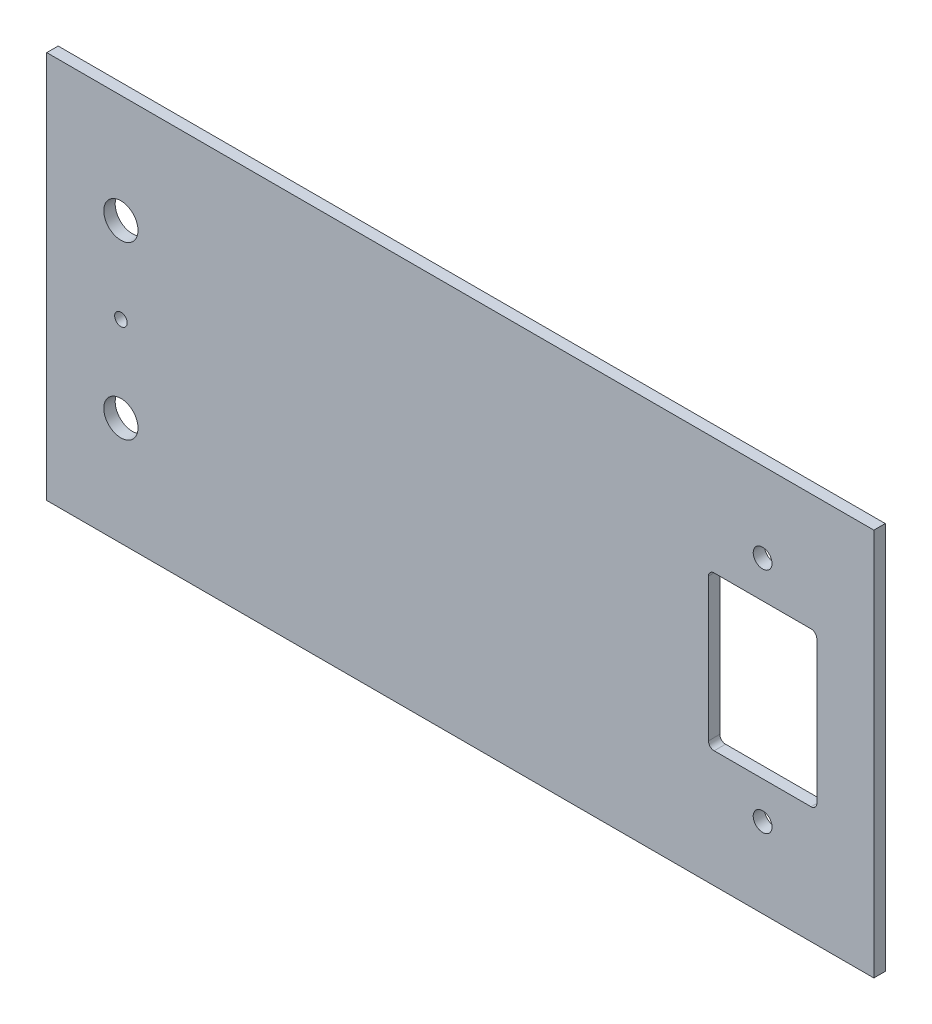
ISO-10303-21;
HEADER;
FILE_DESCRIPTION(('STEP AP214'),'2;1');
FILE_NAME('part.step','',(''),(''),'','','');
FILE_SCHEMA(('AUTOMOTIVE_DESIGN { 1 0 10303 214 1 1 1 1 }'));
ENDSEC;
DATA;
#1=APPLICATION_CONTEXT('core data for automotive mechanical design processes');
#2=APPLICATION_PROTOCOL_DEFINITION('international standard','automotive_design',2000,#1);
#3=PRODUCT_CONTEXT('',#1,'mechanical');
#4=PRODUCT('Part','Part','',(#3));
#5=PRODUCT_RELATED_PRODUCT_CATEGORY('part','',(#4));
#6=PRODUCT_DEFINITION_FORMATION('','',#4);
#7=PRODUCT_DEFINITION_CONTEXT('part definition',#1,'design');
#8=PRODUCT_DEFINITION('design','',#6,#7);
#9=PRODUCT_DEFINITION_SHAPE('','',#8);
#10=(LENGTH_UNIT() NAMED_UNIT(*) SI_UNIT(.MILLI.,.METRE.));
#11=(NAMED_UNIT(*) PLANE_ANGLE_UNIT() SI_UNIT($,.RADIAN.));
#12=(NAMED_UNIT(*) SI_UNIT($,.STERADIAN.) SOLID_ANGLE_UNIT());
#13=UNCERTAINTY_MEASURE_WITH_UNIT(LENGTH_MEASURE(1.E-05),#10,'distance_accuracy_value','');
#14=(GEOMETRIC_REPRESENTATION_CONTEXT(3) GLOBAL_UNCERTAINTY_ASSIGNED_CONTEXT((#13)) GLOBAL_UNIT_ASSIGNED_CONTEXT((#10,
#11,#12)) REPRESENTATION_CONTEXT('',''));
#15=CARTESIAN_POINT('',(0.,0.,0.));
#16=DIRECTION('',(0.,0.,1.));
#17=DIRECTION('',(1.,0.,0.));
#18=AXIS2_PLACEMENT_3D('',#15,#16,#17);
#19=CARTESIAN_POINT('',(-72.5,-34.,2.));
#20=DIRECTION('',(1.,0.,0.));
#21=DIRECTION('',(0.,0.,-1.));
#22=AXIS2_PLACEMENT_3D('',#19,#20,#21);
#23=PLANE('',#22);
#24=DIRECTION('',(0.,-1.,0.));
#25=VECTOR('',#24,1.);
#26=CARTESIAN_POINT('',(-72.5,-34.,0.));
#27=LINE('',#26,#25);
#28=CARTESIAN_POINT('',(-72.5,34.,0.));
#29=VERTEX_POINT('',#28);
#30=CARTESIAN_POINT('',(-72.5,-34.,0.));
#31=VERTEX_POINT('',#30);
#32=EDGE_CURVE('E207',#29,#31,#27,.T.);
#33=ORIENTED_EDGE('',*,*,#32,.T.);
#34=DIRECTION('',(0.,0.,-1.));
#35=VECTOR('',#34,1.);
#36=CARTESIAN_POINT('',(-72.5,-34.,2.));
#37=LINE('',#36,#35);
#38=CARTESIAN_POINT('',(-72.5,-34.,2.));
#39=VERTEX_POINT('',#38);
#40=EDGE_CURVE('E11',#39,#31,#37,.T.);
#41=ORIENTED_EDGE('',*,*,#40,.F.);
#42=DIRECTION('',(0.,-1.,0.));
#43=VECTOR('',#42,1.);
#44=CARTESIAN_POINT('',(-72.5,-34.,2.));
#45=LINE('',#44,#43);
#46=CARTESIAN_POINT('',(-72.5,34.,2.));
#47=VERTEX_POINT('',#46);
#48=EDGE_CURVE('E225',#47,#39,#45,.T.);
#49=ORIENTED_EDGE('',*,*,#48,.F.);
#50=DIRECTION('',(0.,0.,-1.));
#51=VECTOR('',#50,1.);
#52=CARTESIAN_POINT('',(-72.5,34.,2.));
#53=LINE('',#52,#51);
#54=EDGE_CURVE('E239',#47,#29,#53,.T.);
#55=ORIENTED_EDGE('',*,*,#54,.T.);
#56=EDGE_LOOP('',(#33,#41,#49,#55));
#57=FACE_BOUND('',#56,.T.);
#58=ADVANCED_FACE('F39',(#57),#23,.F.);
#59=CARTESIAN_POINT('',(72.5,-34.,2.));
#60=DIRECTION('',(0.,1.,0.));
#61=DIRECTION('',(-1.,0.,0.));
#62=AXIS2_PLACEMENT_3D('',#59,#60,#61);
#63=PLANE('',#62);
#64=DIRECTION('',(1.,0.,0.));
#65=VECTOR('',#64,1.);
#66=CARTESIAN_POINT('',(72.5,-34.,0.));
#67=LINE('',#66,#65);
#68=CARTESIAN_POINT('',(72.5,-34.,0.));
#69=VERTEX_POINT('',#68);
#70=EDGE_CURVE('E243',#31,#69,#67,.T.);
#71=ORIENTED_EDGE('',*,*,#70,.T.);
#72=DIRECTION('',(0.,0.,-1.));
#73=VECTOR('',#72,1.);
#74=CARTESIAN_POINT('',(72.5,-34.,2.));
#75=LINE('',#74,#73);
#76=CARTESIAN_POINT('',(72.5,-34.,2.));
#77=VERTEX_POINT('',#76);
#78=EDGE_CURVE('E47',#77,#69,#75,.T.);
#79=ORIENTED_EDGE('',*,*,#78,.F.);
#80=DIRECTION('',(1.,0.,0.));
#81=VECTOR('',#80,1.);
#82=CARTESIAN_POINT('',(72.5,-34.,2.));
#83=LINE('',#82,#81);
#84=EDGE_CURVE('E229',#39,#77,#83,.T.);
#85=ORIENTED_EDGE('',*,*,#84,.F.);
#86=ORIENTED_EDGE('',*,*,#40,.T.);
#87=EDGE_LOOP('',(#71,#79,#85,#86));
#88=FACE_BOUND('',#87,.T.);
#89=ADVANCED_FACE('F277',(#88),#63,.F.);
#90=CARTESIAN_POINT('',(72.5,-34.,2.));
#91=DIRECTION('',(-1.,0.,0.));
#92=DIRECTION('',(0.,0.,1.));
#93=AXIS2_PLACEMENT_3D('',#90,#91,#92);
#94=PLANE('',#93);
#95=DIRECTION('',(0.,1.,0.));
#96=VECTOR('',#95,1.);
#97=CARTESIAN_POINT('',(72.5,-34.,0.));
#98=LINE('',#97,#96);
#99=CARTESIAN_POINT('',(72.5,34.,0.));
#100=VERTEX_POINT('',#99);
#101=EDGE_CURVE('E246',#69,#100,#98,.T.);
#102=ORIENTED_EDGE('',*,*,#101,.T.);
#103=DIRECTION('',(0.,0.,-1.));
#104=VECTOR('',#103,1.);
#105=CARTESIAN_POINT('',(72.5,34.,2.));
#106=LINE('',#105,#104);
#107=CARTESIAN_POINT('',(72.5,34.,2.));
#108=VERTEX_POINT('',#107);
#109=EDGE_CURVE('E254',#108,#100,#106,.T.);
#110=ORIENTED_EDGE('',*,*,#109,.F.);
#111=DIRECTION('',(0.,1.,0.));
#112=VECTOR('',#111,1.);
#113=CARTESIAN_POINT('',(72.5,-34.,2.));
#114=LINE('',#113,#112);
#115=EDGE_CURVE('E233',#77,#108,#114,.T.);
#116=ORIENTED_EDGE('',*,*,#115,.F.);
#117=ORIENTED_EDGE('',*,*,#78,.T.);
#118=EDGE_LOOP('',(#102,#110,#116,#117));
#119=FACE_BOUND('',#118,.T.);
#120=ADVANCED_FACE('F263',(#119),#94,.F.);
#121=CARTESIAN_POINT('',(72.5,34.,2.));
#122=DIRECTION('',(0.,-1.,0.));
#123=DIRECTION('',(1.,0.,0.));
#124=AXIS2_PLACEMENT_3D('',#121,#122,#123);
#125=PLANE('',#124);
#126=DIRECTION('',(-1.,0.,0.));
#127=VECTOR('',#126,1.);
#128=CARTESIAN_POINT('',(72.5,34.,0.));
#129=LINE('',#128,#127);
#130=EDGE_CURVE('E230',#100,#29,#129,.T.);
#131=ORIENTED_EDGE('',*,*,#130,.T.);
#132=ORIENTED_EDGE('',*,*,#54,.F.);
#133=DIRECTION('',(-1.,0.,0.));
#134=VECTOR('',#133,1.);
#135=CARTESIAN_POINT('',(72.5,34.,2.));
#136=LINE('',#135,#134);
#137=EDGE_CURVE('E236',#108,#47,#136,.T.);
#138=ORIENTED_EDGE('',*,*,#137,.F.);
#139=ORIENTED_EDGE('',*,*,#109,.T.);
#140=EDGE_LOOP('',(#131,#132,#138,#139));
#141=FACE_BOUND('',#140,.T.);
#142=ADVANCED_FACE('F270',(#141),#125,.F.);
#143=CARTESIAN_POINT('',(0.,0.,2.));
#144=DIRECTION('',(0.,0.,1.));
#145=DIRECTION('',(1.,0.,0.));
#146=AXIS2_PLACEMENT_3D('',#143,#144,#145);
#147=PLANE('',#146);
#148=CARTESIAN_POINT('',(52.9999999999999,20.,2.));
#149=DIRECTION('',(0.,0.,1.));
#150=DIRECTION('',(1.,0.,0.));
#151=AXIS2_PLACEMENT_3D('',#148,#149,#150);
#152=CIRCLE('',#151,1.65);
#153=CARTESIAN_POINT('',(54.6499999999999,20.,2.));
#154=VERTEX_POINT('',#153);
#155=EDGE_CURVE('E357',#154,#154,#152,.T.);
#156=ORIENTED_EDGE('',*,*,#155,.F.);
#157=EDGE_LOOP('',(#156));
#158=FACE_BOUND('',#157,.T.);
#159=CARTESIAN_POINT('',(52.9999999999999,-20.,2.));
#160=DIRECTION('',(0.,0.,1.));
#161=DIRECTION('',(1.,0.,0.));
#162=AXIS2_PLACEMENT_3D('',#159,#160,#161);
#163=CIRCLE('',#162,1.65);
#164=CARTESIAN_POINT('',(54.6499999999999,-20.,2.));
#165=VERTEX_POINT('',#164);
#166=EDGE_CURVE('E365',#165,#165,#163,.T.);
#167=ORIENTED_EDGE('',*,*,#166,.F.);
#168=EDGE_LOOP('',(#167));
#169=FACE_BOUND('',#168,.T.);
#170=CARTESIAN_POINT('',(-59.5,15.,2.));
#171=DIRECTION('',(0.,0.,1.));
#172=DIRECTION('',(1.,0.,0.));
#173=AXIS2_PLACEMENT_3D('',#170,#171,#172);
#174=CIRCLE('',#173,3.);
#175=CARTESIAN_POINT('',(-56.5,15.,2.));
#176=VERTEX_POINT('',#175);
#177=EDGE_CURVE('E373',#176,#176,#174,.T.);
#178=ORIENTED_EDGE('',*,*,#177,.F.);
#179=EDGE_LOOP('',(#178));
#180=FACE_BOUND('',#179,.T.);
#181=CARTESIAN_POINT('',(-59.5,-15.,2.));
#182=DIRECTION('',(0.,0.,1.));
#183=DIRECTION('',(1.,0.,0.));
#184=AXIS2_PLACEMENT_3D('',#181,#182,#183);
#185=CIRCLE('',#184,3.);
#186=CARTESIAN_POINT('',(-56.5,-15.,2.));
#187=VERTEX_POINT('',#186);
#188=EDGE_CURVE('E157',#187,#187,#185,.T.);
#189=ORIENTED_EDGE('',*,*,#188,.F.);
#190=EDGE_LOOP('',(#189));
#191=FACE_BOUND('',#190,.T.);
#192=CARTESIAN_POINT('',(-59.5,0.,2.));
#193=DIRECTION('',(0.,0.,1.));
#194=DIRECTION('',(1.,0.,0.));
#195=AXIS2_PLACEMENT_3D('',#192,#193,#194);
#196=CIRCLE('',#195,1.1);
#197=CARTESIAN_POINT('',(-58.4,0.,2.));
#198=VERTEX_POINT('',#197);
#199=EDGE_CURVE('E347',#198,#198,#196,.T.);
#200=ORIENTED_EDGE('',*,*,#199,.F.);
#201=EDGE_LOOP('',(#200));
#202=FACE_BOUND('',#201,.T.);
#203=CARTESIAN_POINT('',(44.4999999999999,-12.5,2.));
#204=DIRECTION('',(0.,0.,1.));
#205=DIRECTION('',(-1.,0.,0.));
#206=AXIS2_PLACEMENT_3D('',#203,#204,#205);
#207=CIRCLE('',#206,1.);
#208=CARTESIAN_POINT('',(43.4999999999999,-12.5,2.));
#209=VERTEX_POINT('',#208);
#210=CARTESIAN_POINT('',(44.5,-13.5,2.));
#211=VERTEX_POINT('',#210);
#212=EDGE_CURVE('E54',#209,#211,#207,.T.);
#213=ORIENTED_EDGE('',*,*,#212,.F.);
#214=DIRECTION('',(0.,-1.,0.));
#215=VECTOR('',#214,1.);
#216=CARTESIAN_POINT('',(43.4999999999999,-12.5,2.));
#217=LINE('',#216,#215);
#218=CARTESIAN_POINT('',(43.4999999999999,12.5,2.));
#219=VERTEX_POINT('',#218);
#220=EDGE_CURVE('E150',#219,#209,#217,.T.);
#221=ORIENTED_EDGE('',*,*,#220,.F.);
#222=CARTESIAN_POINT('',(44.4999999999999,12.5,2.));
#223=DIRECTION('',(0.,0.,1.));
#224=DIRECTION('',(1.,0.,0.));
#225=AXIS2_PLACEMENT_3D('',#222,#223,#224);
#226=CIRCLE('',#225,1.);
#227=CARTESIAN_POINT('',(44.5,13.5,2.));
#228=VERTEX_POINT('',#227);
#229=EDGE_CURVE('E154',#228,#219,#226,.T.);
#230=ORIENTED_EDGE('',*,*,#229,.F.);
#231=DIRECTION('',(-1.,0.,0.));
#232=VECTOR('',#231,1.);
#233=CARTESIAN_POINT('',(61.4999999999999,13.5,2.));
#234=LINE('',#233,#232);
#235=CARTESIAN_POINT('',(61.4999999999999,13.5,2.));
#236=VERTEX_POINT('',#235);
#237=EDGE_CURVE('E197',#236,#228,#234,.T.);
#238=ORIENTED_EDGE('',*,*,#237,.F.);
#239=CARTESIAN_POINT('',(61.4999999999999,12.5,2.));
#240=DIRECTION('',(0.,0.,1.));
#241=DIRECTION('',(1.,0.,0.));
#242=AXIS2_PLACEMENT_3D('',#239,#240,#241);
#243=CIRCLE('',#242,1.);
#244=CARTESIAN_POINT('',(62.4999999999999,12.5,2.));
#245=VERTEX_POINT('',#244);
#246=EDGE_CURVE('E193',#245,#236,#243,.T.);
#247=ORIENTED_EDGE('',*,*,#246,.F.);
#248=DIRECTION('',(0.,1.,0.));
#249=VECTOR('',#248,1.);
#250=CARTESIAN_POINT('',(62.4999999999999,-12.5,2.));
#251=LINE('',#250,#249);
#252=CARTESIAN_POINT('',(62.4999999999999,-12.5,2.));
#253=VERTEX_POINT('',#252);
#254=EDGE_CURVE('E189',#253,#245,#251,.T.);
#255=ORIENTED_EDGE('',*,*,#254,.F.);
#256=CARTESIAN_POINT('',(61.4999999999999,-12.5,2.));
#257=DIRECTION('',(0.,0.,1.));
#258=DIRECTION('',(1.,0.,0.));
#259=AXIS2_PLACEMENT_3D('',#256,#257,#258);
#260=CIRCLE('',#259,1.);
#261=CARTESIAN_POINT('',(61.4999999999999,-13.5,2.));
#262=VERTEX_POINT('',#261);
#263=EDGE_CURVE('E185',#262,#253,#260,.T.);
#264=ORIENTED_EDGE('',*,*,#263,.F.);
#265=DIRECTION('',(1.,0.,0.));
#266=VECTOR('',#265,1.);
#267=CARTESIAN_POINT('',(61.4999999999999,-13.5,2.));
#268=LINE('',#267,#266);
#269=EDGE_CURVE('E181',#211,#262,#268,.T.);
#270=ORIENTED_EDGE('',*,*,#269,.F.);
#271=EDGE_LOOP('',(#213,#221,#230,#238,#247,#255,#264,#270));
#272=FACE_BOUND('',#271,.T.);
#273=ORIENTED_EDGE('',*,*,#48,.T.);
#274=ORIENTED_EDGE('',*,*,#84,.T.);
#275=ORIENTED_EDGE('',*,*,#115,.T.);
#276=ORIENTED_EDGE('',*,*,#137,.T.);
#277=EDGE_LOOP('',(#273,#274,#275,#276));
#278=FACE_BOUND('',#277,.T.);
#279=ADVANCED_FACE('F276',(#158,#169,#180,#191,#202,#272,#278),#147,.T.);
#280=CARTESIAN_POINT('',(0.,0.,0.));
#281=DIRECTION('',(0.,0.,1.));
#282=DIRECTION('',(1.,0.,0.));
#283=AXIS2_PLACEMENT_3D('',#280,#281,#282);
#284=PLANE('',#283);
#285=CARTESIAN_POINT('',(52.9999999999999,20.,0.));
#286=DIRECTION('',(0.,0.,1.));
#287=DIRECTION('',(1.,0.,0.));
#288=AXIS2_PLACEMENT_3D('',#285,#286,#287);
#289=CIRCLE('',#288,1.65);
#290=CARTESIAN_POINT('',(54.6499999999999,20.,0.));
#291=VERTEX_POINT('',#290);
#292=EDGE_CURVE('E182',#291,#291,#289,.T.);
#293=ORIENTED_EDGE('',*,*,#292,.T.);
#294=EDGE_LOOP('',(#293));
#295=FACE_BOUND('',#294,.T.);
#296=CARTESIAN_POINT('',(52.9999999999999,-20.,0.));
#297=DIRECTION('',(0.,0.,1.));
#298=DIRECTION('',(1.,0.,0.));
#299=AXIS2_PLACEMENT_3D('',#296,#297,#298);
#300=CIRCLE('',#299,1.65);
#301=CARTESIAN_POINT('',(54.6499999999999,-20.,0.));
#302=VERTEX_POINT('',#301);
#303=EDGE_CURVE('E361',#302,#302,#300,.T.);
#304=ORIENTED_EDGE('',*,*,#303,.T.);
#305=EDGE_LOOP('',(#304));
#306=FACE_BOUND('',#305,.T.);
#307=CARTESIAN_POINT('',(-59.5,15.,0.));
#308=DIRECTION('',(0.,0.,1.));
#309=DIRECTION('',(1.,0.,0.));
#310=AXIS2_PLACEMENT_3D('',#307,#308,#309);
#311=CIRCLE('',#310,3.);
#312=CARTESIAN_POINT('',(-56.5,15.,0.));
#313=VERTEX_POINT('',#312);
#314=EDGE_CURVE('E369',#313,#313,#311,.T.);
#315=ORIENTED_EDGE('',*,*,#314,.T.);
#316=EDGE_LOOP('',(#315));
#317=FACE_BOUND('',#316,.T.);
#318=CARTESIAN_POINT('',(-59.5,-15.,0.));
#319=DIRECTION('',(0.,0.,1.));
#320=DIRECTION('',(1.,0.,0.));
#321=AXIS2_PLACEMENT_3D('',#318,#319,#320);
#322=CIRCLE('',#321,3.);
#323=CARTESIAN_POINT('',(-56.5,-15.,0.));
#324=VERTEX_POINT('',#323);
#325=EDGE_CURVE('E376',#324,#324,#322,.T.);
#326=ORIENTED_EDGE('',*,*,#325,.T.);
#327=EDGE_LOOP('',(#326));
#328=FACE_BOUND('',#327,.T.);
#329=CARTESIAN_POINT('',(-59.5,0.,0.));
#330=DIRECTION('',(0.,0.,1.));
#331=DIRECTION('',(1.,0.,0.));
#332=AXIS2_PLACEMENT_3D('',#329,#330,#331);
#333=CIRCLE('',#332,1.1);
#334=CARTESIAN_POINT('',(-58.4,0.,0.));
#335=VERTEX_POINT('',#334);
#336=EDGE_CURVE('E344',#335,#335,#333,.T.);
#337=ORIENTED_EDGE('',*,*,#336,.T.);
#338=EDGE_LOOP('',(#337));
#339=FACE_BOUND('',#338,.T.);
#340=DIRECTION('',(0.,-1.,0.));
#341=VECTOR('',#340,1.);
#342=CARTESIAN_POINT('',(43.4999999999999,-12.5,0.));
#343=LINE('',#342,#341);
#344=CARTESIAN_POINT('',(43.4999999999999,12.5,0.));
#345=VERTEX_POINT('',#344);
#346=CARTESIAN_POINT('',(43.4999999999999,-12.5,0.));
#347=VERTEX_POINT('',#346);
#348=EDGE_CURVE('E137',#345,#347,#343,.T.);
#349=ORIENTED_EDGE('',*,*,#348,.T.);
#350=CARTESIAN_POINT('',(44.4999999999999,-12.5,0.));
#351=DIRECTION('',(0.,0.,1.));
#352=DIRECTION('',(-1.,0.,0.));
#353=AXIS2_PLACEMENT_3D('',#350,#351,#352);
#354=CIRCLE('',#353,1.);
#355=CARTESIAN_POINT('',(44.5,-13.5,0.));
#356=VERTEX_POINT('',#355);
#357=EDGE_CURVE('E130',#347,#356,#354,.T.);
#358=ORIENTED_EDGE('',*,*,#357,.T.);
#359=DIRECTION('',(1.,0.,0.));
#360=VECTOR('',#359,1.);
#361=CARTESIAN_POINT('',(61.4999999999999,-13.5,0.));
#362=LINE('',#361,#360);
#363=CARTESIAN_POINT('',(61.4999999999999,-13.5,0.));
#364=VERTEX_POINT('',#363);
#365=EDGE_CURVE('E140',#356,#364,#362,.T.);
#366=ORIENTED_EDGE('',*,*,#365,.T.);
#367=CARTESIAN_POINT('',(61.4999999999999,-12.5,0.));
#368=DIRECTION('',(0.,0.,1.));
#369=DIRECTION('',(1.,0.,0.));
#370=AXIS2_PLACEMENT_3D('',#367,#368,#369);
#371=CIRCLE('',#370,1.);
#372=CARTESIAN_POINT('',(62.4999999999999,-12.5,0.));
#373=VERTEX_POINT('',#372);
#374=EDGE_CURVE('E62',#364,#373,#371,.T.);
#375=ORIENTED_EDGE('',*,*,#374,.T.);
#376=DIRECTION('',(0.,1.,0.));
#377=VECTOR('',#376,1.);
#378=CARTESIAN_POINT('',(62.4999999999999,-12.5,0.));
#379=LINE('',#378,#377);
#380=CARTESIAN_POINT('',(62.4999999999999,12.5,0.));
#381=VERTEX_POINT('',#380);
#382=EDGE_CURVE('E162',#373,#381,#379,.T.);
#383=ORIENTED_EDGE('',*,*,#382,.T.);
#384=CARTESIAN_POINT('',(61.4999999999999,12.5,0.));
#385=DIRECTION('',(0.,0.,1.));
#386=DIRECTION('',(1.,0.,0.));
#387=AXIS2_PLACEMENT_3D('',#384,#385,#386);
#388=CIRCLE('',#387,1.);
#389=CARTESIAN_POINT('',(61.4999999999999,13.5,0.));
#390=VERTEX_POINT('',#389);
#391=EDGE_CURVE('E166',#381,#390,#388,.T.);
#392=ORIENTED_EDGE('',*,*,#391,.T.);
#393=DIRECTION('',(-1.,0.,0.));
#394=VECTOR('',#393,1.);
#395=CARTESIAN_POINT('',(61.4999999999999,13.5,0.));
#396=LINE('',#395,#394);
#397=CARTESIAN_POINT('',(44.5,13.5,0.));
#398=VERTEX_POINT('',#397);
#399=EDGE_CURVE('E170',#390,#398,#396,.T.);
#400=ORIENTED_EDGE('',*,*,#399,.T.);
#401=CARTESIAN_POINT('',(44.4999999999999,12.5,0.));
#402=DIRECTION('',(0.,0.,1.));
#403=DIRECTION('',(1.,0.,0.));
#404=AXIS2_PLACEMENT_3D('',#401,#402,#403);
#405=CIRCLE('',#404,1.);
#406=EDGE_CURVE('E174',#398,#345,#405,.T.);
#407=ORIENTED_EDGE('',*,*,#406,.T.);
#408=EDGE_LOOP('',(#349,#358,#366,#375,#383,#392,#400,#407));
#409=FACE_BOUND('',#408,.T.);
#410=ORIENTED_EDGE('',*,*,#32,.F.);
#411=ORIENTED_EDGE('',*,*,#130,.F.);
#412=ORIENTED_EDGE('',*,*,#101,.F.);
#413=ORIENTED_EDGE('',*,*,#70,.F.);
#414=EDGE_LOOP('',(#410,#411,#412,#413));
#415=FACE_BOUND('',#414,.T.);
#416=ADVANCED_FACE('F145',(#295,#306,#317,#328,#339,#409,#415),#284,.F.);
#417=CARTESIAN_POINT('',(44.4999999999999,-12.5,0.));
#418=DIRECTION('',(0.,0.,1.));
#419=DIRECTION('',(1.,0.,0.));
#420=AXIS2_PLACEMENT_3D('',#417,#418,#419);
#421=CYLINDRICAL_SURFACE('',#420,1.);
#422=ORIENTED_EDGE('',*,*,#212,.T.);
#423=DIRECTION('',(0.,0.,1.));
#424=VECTOR('',#423,1.);
#425=CARTESIAN_POINT('',(44.5,-13.5,0.));
#426=LINE('',#425,#424);
#427=EDGE_CURVE('E126',#356,#211,#426,.T.);
#428=ORIENTED_EDGE('',*,*,#427,.F.);
#429=ORIENTED_EDGE('',*,*,#357,.F.);
#430=DIRECTION('',(0.,0.,1.));
#431=VECTOR('',#430,1.);
#432=CARTESIAN_POINT('',(43.4999999999999,-12.5,0.));
#433=LINE('',#432,#431);
#434=EDGE_CURVE('E204',#347,#209,#433,.T.);
#435=ORIENTED_EDGE('',*,*,#434,.T.);
#436=EDGE_LOOP('',(#422,#428,#429,#435));
#437=FACE_BOUND('',#436,.T.);
#438=ADVANCED_FACE('F128',(#437),#421,.F.);
#439=CARTESIAN_POINT('',(43.4999999999999,-12.5,0.));
#440=DIRECTION('',(-1.,0.,0.));
#441=DIRECTION('',(0.,0.,1.));
#442=AXIS2_PLACEMENT_3D('',#439,#440,#441);
#443=PLANE('',#442);
#444=ORIENTED_EDGE('',*,*,#220,.T.);
#445=ORIENTED_EDGE('',*,*,#434,.F.);
#446=ORIENTED_EDGE('',*,*,#348,.F.);
#447=DIRECTION('',(0.,0.,1.));
#448=VECTOR('',#447,1.);
#449=CARTESIAN_POINT('',(43.4999999999999,12.5,0.));
#450=LINE('',#449,#448);
#451=EDGE_CURVE('E208',#345,#219,#450,.T.);
#452=ORIENTED_EDGE('',*,*,#451,.T.);
#453=EDGE_LOOP('',(#444,#445,#446,#452));
#454=FACE_BOUND('',#453,.T.);
#455=ADVANCED_FACE('F295',(#454),#443,.F.);
#456=CARTESIAN_POINT('',(44.4999999999999,12.5,0.));
#457=DIRECTION('',(0.,0.,1.));
#458=DIRECTION('',(1.,0.,0.));
#459=AXIS2_PLACEMENT_3D('',#456,#457,#458);
#460=CYLINDRICAL_SURFACE('',#459,1.);
#461=ORIENTED_EDGE('',*,*,#229,.T.);
#462=ORIENTED_EDGE('',*,*,#451,.F.);
#463=ORIENTED_EDGE('',*,*,#406,.F.);
#464=DIRECTION('',(0.,0.,1.));
#465=VECTOR('',#464,1.);
#466=CARTESIAN_POINT('',(44.5,13.5,0.));
#467=LINE('',#466,#465);
#468=EDGE_CURVE('E211',#398,#228,#467,.T.);
#469=ORIENTED_EDGE('',*,*,#468,.T.);
#470=EDGE_LOOP('',(#461,#462,#463,#469));
#471=FACE_BOUND('',#470,.T.);
#472=ADVANCED_FACE('F313',(#471),#460,.F.);
#473=CARTESIAN_POINT('',(61.4999999999999,13.5,0.));
#474=DIRECTION('',(0.,1.,0.));
#475=DIRECTION('',(-1.,0.,0.));
#476=AXIS2_PLACEMENT_3D('',#473,#474,#475);
#477=PLANE('',#476);
#478=ORIENTED_EDGE('',*,*,#237,.T.);
#479=ORIENTED_EDGE('',*,*,#468,.F.);
#480=ORIENTED_EDGE('',*,*,#399,.F.);
#481=DIRECTION('',(0.,0.,1.));
#482=VECTOR('',#481,1.);
#483=CARTESIAN_POINT('',(61.4999999999999,13.5,0.));
#484=LINE('',#483,#482);
#485=EDGE_CURVE('E214',#390,#236,#484,.T.);
#486=ORIENTED_EDGE('',*,*,#485,.T.);
#487=EDGE_LOOP('',(#478,#479,#480,#486));
#488=FACE_BOUND('',#487,.T.);
#489=ADVANCED_FACE('F309',(#488),#477,.F.);
#490=CARTESIAN_POINT('',(61.4999999999999,12.5,0.));
#491=DIRECTION('',(0.,0.,1.));
#492=DIRECTION('',(1.,0.,0.));
#493=AXIS2_PLACEMENT_3D('',#490,#491,#492);
#494=CYLINDRICAL_SURFACE('',#493,1.);
#495=ORIENTED_EDGE('',*,*,#246,.T.);
#496=ORIENTED_EDGE('',*,*,#485,.F.);
#497=ORIENTED_EDGE('',*,*,#391,.F.);
#498=DIRECTION('',(0.,0.,1.));
#499=VECTOR('',#498,1.);
#500=CARTESIAN_POINT('',(62.4999999999999,12.5,0.));
#501=LINE('',#500,#499);
#502=EDGE_CURVE('E217',#381,#245,#501,.T.);
#503=ORIENTED_EDGE('',*,*,#502,.T.);
#504=EDGE_LOOP('',(#495,#496,#497,#503));
#505=FACE_BOUND('',#504,.T.);
#506=ADVANCED_FACE('F305',(#505),#494,.F.);
#507=CARTESIAN_POINT('',(62.4999999999999,-12.5,0.));
#508=DIRECTION('',(1.,0.,0.));
#509=DIRECTION('',(0.,0.,-1.));
#510=AXIS2_PLACEMENT_3D('',#507,#508,#509);
#511=PLANE('',#510);
#512=ORIENTED_EDGE('',*,*,#254,.T.);
#513=ORIENTED_EDGE('',*,*,#502,.F.);
#514=ORIENTED_EDGE('',*,*,#382,.F.);
#515=DIRECTION('',(0.,0.,1.));
#516=VECTOR('',#515,1.);
#517=CARTESIAN_POINT('',(62.4999999999999,-12.5,0.));
#518=LINE('',#517,#516);
#519=EDGE_CURVE('E220',#373,#253,#518,.T.);
#520=ORIENTED_EDGE('',*,*,#519,.T.);
#521=EDGE_LOOP('',(#512,#513,#514,#520));
#522=FACE_BOUND('',#521,.T.);
#523=ADVANCED_FACE('F302',(#522),#511,.F.);
#524=CARTESIAN_POINT('',(61.4999999999999,-12.5,0.));
#525=DIRECTION('',(0.,0.,1.));
#526=DIRECTION('',(1.,0.,0.));
#527=AXIS2_PLACEMENT_3D('',#524,#525,#526);
#528=CYLINDRICAL_SURFACE('',#527,1.);
#529=ORIENTED_EDGE('',*,*,#263,.T.);
#530=ORIENTED_EDGE('',*,*,#519,.F.);
#531=ORIENTED_EDGE('',*,*,#374,.F.);
#532=DIRECTION('',(0.,0.,1.));
#533=VECTOR('',#532,1.);
#534=CARTESIAN_POINT('',(61.4999999999999,-13.5,0.));
#535=LINE('',#534,#533);
#536=EDGE_CURVE('E136',#364,#262,#535,.T.);
#537=ORIENTED_EDGE('',*,*,#536,.T.);
#538=EDGE_LOOP('',(#529,#530,#531,#537));
#539=FACE_BOUND('',#538,.T.);
#540=ADVANCED_FACE('F299',(#539),#528,.F.);
#541=CARTESIAN_POINT('',(61.4999999999999,-13.5,0.));
#542=DIRECTION('',(0.,-1.,0.));
#543=DIRECTION('',(1.,0.,0.));
#544=AXIS2_PLACEMENT_3D('',#541,#542,#543);
#545=PLANE('',#544);
#546=ORIENTED_EDGE('',*,*,#269,.T.);
#547=ORIENTED_EDGE('',*,*,#536,.F.);
#548=ORIENTED_EDGE('',*,*,#365,.F.);
#549=ORIENTED_EDGE('',*,*,#427,.T.);
#550=EDGE_LOOP('',(#546,#547,#548,#549));
#551=FACE_BOUND('',#550,.T.);
#552=ADVANCED_FACE('F141',(#551),#545,.F.);
#553=CARTESIAN_POINT('',(-59.5,0.,0.));
#554=DIRECTION('',(0.,0.,1.));
#555=DIRECTION('',(1.,0.,0.));
#556=AXIS2_PLACEMENT_3D('',#553,#554,#555);
#557=CYLINDRICAL_SURFACE('',#556,1.1);
#558=ORIENTED_EDGE('',*,*,#336,.F.);
#559=EDGE_LOOP('',(#558));
#560=FACE_BOUND('',#559,.T.);
#561=ORIENTED_EDGE('',*,*,#199,.T.);
#562=EDGE_LOOP('',(#561));
#563=FACE_BOUND('',#562,.T.);
#564=ADVANCED_FACE('F298',(#560,#563),#557,.F.);
#565=CARTESIAN_POINT('',(-59.5,-15.,0.));
#566=DIRECTION('',(0.,0.,1.));
#567=DIRECTION('',(1.,0.,0.));
#568=AXIS2_PLACEMENT_3D('',#565,#566,#567);
#569=CYLINDRICAL_SURFACE('',#568,3.);
#570=ORIENTED_EDGE('',*,*,#325,.F.);
#571=EDGE_LOOP('',(#570));
#572=FACE_BOUND('',#571,.T.);
#573=ORIENTED_EDGE('',*,*,#188,.T.);
#574=EDGE_LOOP('',(#573));
#575=FACE_BOUND('',#574,.T.);
#576=ADVANCED_FACE('F321',(#572,#575),#569,.F.);
#577=CARTESIAN_POINT('',(-59.5,15.,0.));
#578=DIRECTION('',(0.,0.,1.));
#579=DIRECTION('',(1.,0.,0.));
#580=AXIS2_PLACEMENT_3D('',#577,#578,#579);
#581=CYLINDRICAL_SURFACE('',#580,3.);
#582=ORIENTED_EDGE('',*,*,#314,.F.);
#583=EDGE_LOOP('',(#582));
#584=FACE_BOUND('',#583,.T.);
#585=ORIENTED_EDGE('',*,*,#177,.T.);
#586=EDGE_LOOP('',(#585));
#587=FACE_BOUND('',#586,.T.);
#588=ADVANCED_FACE('F324',(#584,#587),#581,.F.);
#589=CARTESIAN_POINT('',(52.9999999999999,-20.,0.));
#590=DIRECTION('',(0.,0.,1.));
#591=DIRECTION('',(1.,0.,0.));
#592=AXIS2_PLACEMENT_3D('',#589,#590,#591);
#593=CYLINDRICAL_SURFACE('',#592,1.65);
#594=ORIENTED_EDGE('',*,*,#303,.F.);
#595=EDGE_LOOP('',(#594));
#596=FACE_BOUND('',#595,.T.);
#597=ORIENTED_EDGE('',*,*,#166,.T.);
#598=EDGE_LOOP('',(#597));
#599=FACE_BOUND('',#598,.T.);
#600=ADVANCED_FACE('F328',(#596,#599),#593,.F.);
#601=CARTESIAN_POINT('',(52.9999999999999,20.,0.));
#602=DIRECTION('',(0.,0.,1.));
#603=DIRECTION('',(1.,0.,0.));
#604=AXIS2_PLACEMENT_3D('',#601,#602,#603);
#605=CYLINDRICAL_SURFACE('',#604,1.65);
#606=ORIENTED_EDGE('',*,*,#292,.F.);
#607=EDGE_LOOP('',(#606));
#608=FACE_BOUND('',#607,.T.);
#609=ORIENTED_EDGE('',*,*,#155,.T.);
#610=EDGE_LOOP('',(#609));
#611=FACE_BOUND('',#610,.T.);
#612=ADVANCED_FACE('F332',(#608,#611),#605,.F.);
#613=CLOSED_SHELL('',(#58,#89,#120,#142,#279,#416,#438,#455,#472,#489,#506,#523,#540,#552,#564,
#576,#588,#600,#612));
#614=MANIFOLD_SOLID_BREP('B2',#613);
#615=ADVANCED_BREP_SHAPE_REPRESENTATION('',(#18,#614),#14);
#616=SHAPE_DEFINITION_REPRESENTATION(#9,#615);
ENDSEC;
END-ISO-10303-21;
